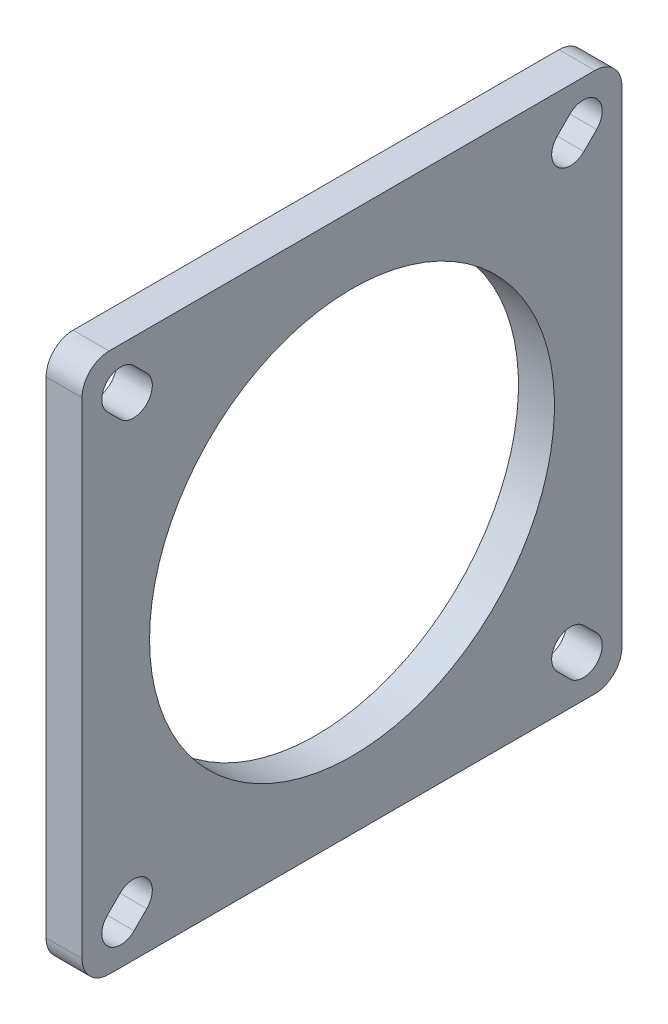
ISO-10303-21;
HEADER;
FILE_DESCRIPTION(('STEP AP214'),'2;1');
FILE_NAME('part.step','',(''),(''),'','','');
FILE_SCHEMA(('AUTOMOTIVE_DESIGN { 1 0 10303 214 1 1 1 1 }'));
ENDSEC;
DATA;
#1=APPLICATION_CONTEXT('core data for automotive mechanical design processes');
#2=APPLICATION_PROTOCOL_DEFINITION('international standard','automotive_design',2000,#1);
#3=PRODUCT_CONTEXT('',#1,'mechanical');
#4=PRODUCT('Part','Part','',(#3));
#5=PRODUCT_RELATED_PRODUCT_CATEGORY('part','',(#4));
#6=PRODUCT_DEFINITION_FORMATION('','',#4);
#7=PRODUCT_DEFINITION_CONTEXT('part definition',#1,'design');
#8=PRODUCT_DEFINITION('design','',#6,#7);
#9=PRODUCT_DEFINITION_SHAPE('','',#8);
#10=(LENGTH_UNIT() NAMED_UNIT(*) SI_UNIT(.MILLI.,.METRE.));
#11=(NAMED_UNIT(*) PLANE_ANGLE_UNIT() SI_UNIT($,.RADIAN.));
#12=(NAMED_UNIT(*) SI_UNIT($,.STERADIAN.) SOLID_ANGLE_UNIT());
#13=UNCERTAINTY_MEASURE_WITH_UNIT(LENGTH_MEASURE(1.E-05),#10,'distance_accuracy_value','');
#14=(GEOMETRIC_REPRESENTATION_CONTEXT(3) GLOBAL_UNCERTAINTY_ASSIGNED_CONTEXT((#13)) GLOBAL_UNIT_ASSIGNED_CONTEXT((#10,
#11,#12)) REPRESENTATION_CONTEXT('',''));
#15=CARTESIAN_POINT('',(0.,0.,0.));
#16=DIRECTION('',(0.,0.,1.));
#17=DIRECTION('',(1.,0.,0.));
#18=AXIS2_PLACEMENT_3D('',#15,#16,#17);
#19=CARTESIAN_POINT('',(0.,22.5,0.));
#20=DIRECTION('',(1.,0.,0.));
#21=DIRECTION('',(0.,0.,-1.));
#22=AXIS2_PLACEMENT_3D('',#19,#20,#21);
#23=PLANE('',#22);
#24=DIRECTION('',(0.,-0.707106781186549,-0.707106781186546));
#25=VECTOR('',#24,1.);
#26=CARTESIAN_POINT('',(0.,-27.1920310216784,-24.222182540695));
#27=LINE('',#26,#25);
#28=CARTESIAN_POINT('',(0.,-27.1920310216784,-24.222182540695));
#29=VERTEX_POINT('',#28);
#30=CARTESIAN_POINT('',(0.,-25.7778174593053,-22.8079689783219));
#31=VERTEX_POINT('',#30);
#32=EDGE_CURVE('E369',#29,#31,#27,.F.);
#33=ORIENTED_EDGE('',*,*,#32,.F.);
#34=CARTESIAN_POINT('',(0.,-25.7071067811866,-25.7071067811867));
#35=DIRECTION('',(-1.,0.,0.));
#36=DIRECTION('',(0.,0.,1.));
#37=AXIS2_PLACEMENT_3D('',#34,#35,#36);
#38=CIRCLE('',#37,2.1);
#39=CARTESIAN_POINT('',(0.,-24.2221825406949,-27.1920310216785));
#40=VERTEX_POINT('',#39);
#41=EDGE_CURVE('E216',#40,#29,#38,.T.);
#42=ORIENTED_EDGE('',*,*,#41,.F.);
#43=DIRECTION('',(0.,0.707106781186547,0.707106781186549));
#44=VECTOR('',#43,1.);
#45=CARTESIAN_POINT('',(0.,-24.2221825406949,-27.1920310216785));
#46=LINE('',#45,#44);
#47=CARTESIAN_POINT('',(0.,-22.8079689783218,-25.7778174593054));
#48=VERTEX_POINT('',#47);
#49=EDGE_CURVE('E373',#48,#40,#46,.F.);
#50=ORIENTED_EDGE('',*,*,#49,.F.);
#51=CARTESIAN_POINT('',(0.,-24.2928932188135,-24.2928932188136));
#52=DIRECTION('',(-1.,0.,0.));
#53=DIRECTION('',(0.,0.,1.));
#54=AXIS2_PLACEMENT_3D('',#51,#52,#53);
#55=CIRCLE('',#54,2.09999999999999);
#56=EDGE_CURVE('E371',#31,#48,#55,.T.);
#57=ORIENTED_EDGE('',*,*,#56,.F.);
#58=EDGE_LOOP('',(#33,#42,#50,#57));
#59=FACE_BOUND('',#58,.T.);
#60=DIRECTION('',(0.,-0.707106781186548,0.707106781186547));
#61=VECTOR('',#60,1.);
#62=CARTESIAN_POINT('',(0.,-24.2221825406951,27.1920310216783));
#63=LINE('',#62,#61);
#64=CARTESIAN_POINT('',(0.,-24.2221825406951,27.1920310216783));
#65=VERTEX_POINT('',#64);
#66=CARTESIAN_POINT('',(0.,-22.807968978322,25.7778174593052));
#67=VERTEX_POINT('',#66);
#68=EDGE_CURVE('E360',#65,#67,#63,.F.);
#69=ORIENTED_EDGE('',*,*,#68,.F.);
#70=CARTESIAN_POINT('',(0.,-25.7071067811868,25.7071067811865));
#71=DIRECTION('',(-1.,0.,0.));
#72=DIRECTION('',(0.,0.,1.));
#73=AXIS2_PLACEMENT_3D('',#70,#71,#72);
#74=CIRCLE('',#73,2.1);
#75=CARTESIAN_POINT('',(0.,-27.1920310216786,24.2221825406948));
#76=VERTEX_POINT('',#75);
#77=EDGE_CURVE('E366',#76,#65,#74,.T.);
#78=ORIENTED_EDGE('',*,*,#77,.F.);
#79=DIRECTION('',(0.,0.707106781186551,-0.707106781186544));
#80=VECTOR('',#79,1.);
#81=CARTESIAN_POINT('',(0.,-27.1920310216786,24.2221825406948));
#82=LINE('',#81,#80);
#83=CARTESIAN_POINT('',(0.,-25.7778174593055,22.8079689783217));
#84=VERTEX_POINT('',#83);
#85=EDGE_CURVE('E364',#84,#76,#82,.F.);
#86=ORIENTED_EDGE('',*,*,#85,.F.);
#87=CARTESIAN_POINT('',(0.,-24.2928932188137,24.2928932188135));
#88=DIRECTION('',(-1.,0.,0.));
#89=DIRECTION('',(0.,0.,1.));
#90=AXIS2_PLACEMENT_3D('',#87,#88,#89);
#91=CIRCLE('',#90,2.09999999999999);
#92=EDGE_CURVE('E362',#67,#84,#91,.T.);
#93=ORIENTED_EDGE('',*,*,#92,.F.);
#94=EDGE_LOOP('',(#69,#78,#86,#93));
#95=FACE_BOUND('',#94,.T.);
#96=DIRECTION('',(0.,0.707106781186554,0.707106781186541));
#97=VECTOR('',#96,1.);
#98=CARTESIAN_POINT('',(0.,27.1920310216786,24.2221825406948));
#99=LINE('',#98,#97);
#100=CARTESIAN_POINT('',(0.,27.1920310216786,24.2221825406948));
#101=VERTEX_POINT('',#100);
#102=CARTESIAN_POINT('',(0.,25.7778174593054,22.8079689783217));
#103=VERTEX_POINT('',#102);
#104=EDGE_CURVE('E246',#101,#103,#99,.F.);
#105=ORIENTED_EDGE('',*,*,#104,.F.);
#106=CARTESIAN_POINT('',(0.,25.7071067811868,25.7071067811866));
#107=DIRECTION('',(-1.,0.,0.));
#108=DIRECTION('',(0.,0.,1.));
#109=AXIS2_PLACEMENT_3D('',#106,#107,#108);
#110=CIRCLE('',#109,2.1);
#111=CARTESIAN_POINT('',(0.,24.2221825406951,27.1920310216783));
#112=VERTEX_POINT('',#111);
#113=EDGE_CURVE('E357',#112,#101,#110,.T.);
#114=ORIENTED_EDGE('',*,*,#113,.F.);
#115=DIRECTION('',(0.,-0.707106781186551,-0.707106781186544));
#116=VECTOR('',#115,1.);
#117=CARTESIAN_POINT('',(0.,24.2221825406951,27.1920310216783));
#118=LINE('',#117,#116);
#119=CARTESIAN_POINT('',(0.,22.807968978322,25.7778174593052));
#120=VERTEX_POINT('',#119);
#121=EDGE_CURVE('E355',#120,#112,#118,.F.);
#122=ORIENTED_EDGE('',*,*,#121,.F.);
#123=CARTESIAN_POINT('',(0.,24.2928932188137,24.2928932188135));
#124=DIRECTION('',(-1.,0.,0.));
#125=DIRECTION('',(0.,0.,1.));
#126=AXIS2_PLACEMENT_3D('',#123,#124,#125);
#127=CIRCLE('',#126,2.09999999999999);
#128=EDGE_CURVE('E353',#103,#120,#127,.T.);
#129=ORIENTED_EDGE('',*,*,#128,.F.);
#130=EDGE_LOOP('',(#105,#114,#122,#129));
#131=FACE_BOUND('',#130,.T.);
#132=DIRECTION('',(0.,0.707106781186548,-0.707106781186547));
#133=VECTOR('',#132,1.);
#134=CARTESIAN_POINT('',(0.,24.2221825406951,-27.1920310216783));
#135=LINE('',#134,#133);
#136=CARTESIAN_POINT('',(0.,24.2221825406951,-27.1920310216783));
#137=VERTEX_POINT('',#136);
#138=CARTESIAN_POINT('',(0.,22.807968978322,-25.7778174593052));
#139=VERTEX_POINT('',#138);
#140=EDGE_CURVE('E311',#137,#139,#135,.F.);
#141=ORIENTED_EDGE('',*,*,#140,.F.);
#142=CARTESIAN_POINT('',(0.,25.7071067811868,-25.7071067811865));
#143=DIRECTION('',(-1.,0.,0.));
#144=DIRECTION('',(0.,0.,1.));
#145=AXIS2_PLACEMENT_3D('',#142,#143,#144);
#146=CIRCLE('',#145,2.1);
#147=CARTESIAN_POINT('',(0.,27.1920310216786,-24.2221825406948));
#148=VERTEX_POINT('',#147);
#149=EDGE_CURVE('E319',#148,#137,#146,.T.);
#150=ORIENTED_EDGE('',*,*,#149,.F.);
#151=DIRECTION('',(0.,-0.707106781186551,0.707106781186544));
#152=VECTOR('',#151,1.);
#153=CARTESIAN_POINT('',(0.,27.1920310216786,-24.2221825406948));
#154=LINE('',#153,#152);
#155=CARTESIAN_POINT('',(0.,25.7778174593055,-22.8079689783217));
#156=VERTEX_POINT('',#155);
#157=EDGE_CURVE('E348',#156,#148,#154,.F.);
#158=ORIENTED_EDGE('',*,*,#157,.F.);
#159=CARTESIAN_POINT('',(0.,24.2928932188137,-24.2928932188135));
#160=DIRECTION('',(-1.,0.,0.));
#161=DIRECTION('',(0.,0.,1.));
#162=AXIS2_PLACEMENT_3D('',#159,#160,#161);
#163=CIRCLE('',#162,2.09999999999999);
#164=EDGE_CURVE('E346',#139,#156,#163,.T.);
#165=ORIENTED_EDGE('',*,*,#164,.F.);
#166=EDGE_LOOP('',(#141,#150,#158,#165));
#167=FACE_BOUND('',#166,.T.);
#168=CARTESIAN_POINT('',(0.,0.,0.));
#169=DIRECTION('',(-1.,0.,0.));
#170=DIRECTION('',(0.,0.,1.));
#171=AXIS2_PLACEMENT_3D('',#168,#169,#170);
#172=CIRCLE('',#171,22.5);
#173=CARTESIAN_POINT('',(0.,0.,22.5));
#174=VERTEX_POINT('',#173);
#175=EDGE_CURVE('E341',#174,#174,#172,.T.);
#176=ORIENTED_EDGE('',*,*,#175,.F.);
#177=EDGE_LOOP('',(#176));
#178=FACE_BOUND('',#177,.T.);
#179=DIRECTION('',(0.,1.,0.));
#180=VECTOR('',#179,1.);
#181=CARTESIAN_POINT('',(0.,22.5,-30.));
#182=LINE('',#181,#180);
#183=CARTESIAN_POINT('',(0.,-27.,-30.));
#184=VERTEX_POINT('',#183);
#185=CARTESIAN_POINT('',(0.,27.,-30.));
#186=VERTEX_POINT('',#185);
#187=EDGE_CURVE('E335',#184,#186,#182,.T.);
#188=ORIENTED_EDGE('',*,*,#187,.F.);
#189=CARTESIAN_POINT('',(0.,-27.,-27.));
#190=DIRECTION('',(1.,0.,0.));
#191=DIRECTION('',(0.,0.,-1.));
#192=AXIS2_PLACEMENT_3D('',#189,#190,#191);
#193=CIRCLE('',#192,3.);
#194=CARTESIAN_POINT('',(0.,-30.,-27.));
#195=VERTEX_POINT('',#194);
#196=EDGE_CURVE('E386',#184,#195,#193,.F.);
#197=ORIENTED_EDGE('',*,*,#196,.T.);
#198=DIRECTION('',(0.,0.,-1.));
#199=VECTOR('',#198,1.);
#200=CARTESIAN_POINT('',(0.,-30.,0.));
#201=LINE('',#200,#199);
#202=CARTESIAN_POINT('',(0.,-30.,27.));
#203=VERTEX_POINT('',#202);
#204=EDGE_CURVE('E327',#203,#195,#201,.T.);
#205=ORIENTED_EDGE('',*,*,#204,.F.);
#206=CARTESIAN_POINT('',(0.,-27.,27.));
#207=DIRECTION('',(1.,0.,0.));
#208=DIRECTION('',(0.,0.,-1.));
#209=AXIS2_PLACEMENT_3D('',#206,#207,#208);
#210=CIRCLE('',#209,3.);
#211=CARTESIAN_POINT('',(0.,-27.,30.));
#212=VERTEX_POINT('',#211);
#213=EDGE_CURVE('E384',#203,#212,#210,.F.);
#214=ORIENTED_EDGE('',*,*,#213,.T.);
#215=DIRECTION('',(0.,-1.,0.));
#216=VECTOR('',#215,1.);
#217=CARTESIAN_POINT('',(0.,22.5,30.));
#218=LINE('',#217,#216);
#219=CARTESIAN_POINT('',(0.,27.,30.));
#220=VERTEX_POINT('',#219);
#221=EDGE_CURVE('E330',#220,#212,#218,.T.);
#222=ORIENTED_EDGE('',*,*,#221,.F.);
#223=CARTESIAN_POINT('',(0.,27.,27.));
#224=DIRECTION('',(1.,0.,0.));
#225=DIRECTION('',(0.,0.,-1.));
#226=AXIS2_PLACEMENT_3D('',#223,#224,#225);
#227=CIRCLE('',#226,3.);
#228=CARTESIAN_POINT('',(0.,30.,27.));
#229=VERTEX_POINT('',#228);
#230=EDGE_CURVE('E382',#220,#229,#227,.F.);
#231=ORIENTED_EDGE('',*,*,#230,.T.);
#232=DIRECTION('',(0.,0.,1.));
#233=VECTOR('',#232,1.);
#234=CARTESIAN_POINT('',(0.,30.,0.));
#235=LINE('',#234,#233);
#236=CARTESIAN_POINT('',(0.,30.,-27.));
#237=VERTEX_POINT('',#236);
#238=EDGE_CURVE('E332',#237,#229,#235,.T.);
#239=ORIENTED_EDGE('',*,*,#238,.F.);
#240=CARTESIAN_POINT('',(0.,27.,-27.));
#241=DIRECTION('',(1.,0.,0.));
#242=DIRECTION('',(0.,0.,-1.));
#243=AXIS2_PLACEMENT_3D('',#240,#241,#242);
#244=CIRCLE('',#243,3.);
#245=EDGE_CURVE('E380',#237,#186,#244,.F.);
#246=ORIENTED_EDGE('',*,*,#245,.T.);
#247=EDGE_LOOP('',(#188,#197,#205,#214,#222,#231,#239,#246));
#248=FACE_BOUND('',#247,.T.);
#249=ADVANCED_FACE('F46',(#59,#95,#131,#167,#178,#248),#23,.F.);
#250=CARTESIAN_POINT('',(4.,50.,0.));
#251=DIRECTION('',(-1.,0.,0.));
#252=DIRECTION('',(0.,0.,1.));
#253=AXIS2_PLACEMENT_3D('',#250,#251,#252);
#254=PLANE('',#253);
#255=DIRECTION('',(0.,-0.707106781186546,-0.707106781186549));
#256=VECTOR('',#255,1.);
#257=CARTESIAN_POINT('',(4.00000000000001,-24.2221825406949,-27.1920310216785));
#258=LINE('',#257,#256);
#259=CARTESIAN_POINT('',(4.00000000000001,-22.8079689783218,-25.7778174593054));
#260=VERTEX_POINT('',#259);
#261=CARTESIAN_POINT('',(4.00000000000001,-24.2221825406949,-27.1920310216785));
#262=VERTEX_POINT('',#261);
#263=EDGE_CURVE('E220',#260,#262,#258,.T.);
#264=ORIENTED_EDGE('',*,*,#263,.T.);
#265=CARTESIAN_POINT('',(4.00000000000001,-25.7071067811866,-25.7071067811867));
#266=DIRECTION('',(-1.,0.,0.));
#267=DIRECTION('',(0.,1.,0.));
#268=AXIS2_PLACEMENT_3D('',#265,#266,#267);
#269=CIRCLE('',#268,2.1);
#270=CARTESIAN_POINT('',(4.00000000000001,-27.1920310216784,-24.222182540695));
#271=VERTEX_POINT('',#270);
#272=EDGE_CURVE('E213',#262,#271,#269,.T.);
#273=ORIENTED_EDGE('',*,*,#272,.T.);
#274=DIRECTION('',(0.,0.707106781186549,0.707106781186546));
#275=VECTOR('',#274,1.);
#276=CARTESIAN_POINT('',(4.00000000000001,-27.1920310216784,-24.222182540695));
#277=LINE('',#276,#275);
#278=CARTESIAN_POINT('',(4.,-25.7778174593053,-22.8079689783219));
#279=VERTEX_POINT('',#278);
#280=EDGE_CURVE('E224',#271,#279,#277,.T.);
#281=ORIENTED_EDGE('',*,*,#280,.T.);
#282=CARTESIAN_POINT('',(4.00000000000001,-24.2928932188135,-24.2928932188136));
#283=DIRECTION('',(-1.,0.,0.));
#284=DIRECTION('',(0.,1.,0.));
#285=AXIS2_PLACEMENT_3D('',#282,#283,#284);
#286=CIRCLE('',#285,2.09999999999999);
#287=EDGE_CURVE('E229',#279,#260,#286,.T.);
#288=ORIENTED_EDGE('',*,*,#287,.T.);
#289=EDGE_LOOP('',(#264,#273,#281,#288));
#290=FACE_BOUND('',#289,.T.);
#291=DIRECTION('',(0.,-0.707106781186551,0.707106781186544));
#292=VECTOR('',#291,1.);
#293=CARTESIAN_POINT('',(4.00000000000001,-27.1920310216786,24.2221825406948));
#294=LINE('',#293,#292);
#295=CARTESIAN_POINT('',(4.00000000000001,-25.7778174593055,22.8079689783217));
#296=VERTEX_POINT('',#295);
#297=CARTESIAN_POINT('',(4.00000000000001,-27.1920310216786,24.2221825406948));
#298=VERTEX_POINT('',#297);
#299=EDGE_CURVE('E259',#296,#298,#294,.T.);
#300=ORIENTED_EDGE('',*,*,#299,.T.);
#301=CARTESIAN_POINT('',(4.00000000000001,-25.7071067811868,25.7071067811865));
#302=DIRECTION('',(-1.,0.,0.));
#303=DIRECTION('',(0.,0.,-1.));
#304=AXIS2_PLACEMENT_3D('',#301,#302,#303);
#305=CIRCLE('',#304,2.1);
#306=CARTESIAN_POINT('',(4.00000000000001,-24.2221825406951,27.1920310216783));
#307=VERTEX_POINT('',#306);
#308=EDGE_CURVE('E249',#298,#307,#305,.T.);
#309=ORIENTED_EDGE('',*,*,#308,.T.);
#310=DIRECTION('',(0.,0.707106781186548,-0.707106781186547));
#311=VECTOR('',#310,1.);
#312=CARTESIAN_POINT('',(4.00000000000001,-24.2221825406951,27.1920310216783));
#313=LINE('',#312,#311);
#314=CARTESIAN_POINT('',(4.,-22.807968978322,25.7778174593052));
#315=VERTEX_POINT('',#314);
#316=EDGE_CURVE('E252',#307,#315,#313,.T.);
#317=ORIENTED_EDGE('',*,*,#316,.T.);
#318=CARTESIAN_POINT('',(4.00000000000001,-24.2928932188137,24.2928932188135));
#319=DIRECTION('',(-1.,0.,0.));
#320=DIRECTION('',(0.,0.,-1.));
#321=AXIS2_PLACEMENT_3D('',#318,#319,#320);
#322=CIRCLE('',#321,2.09999999999999);
#323=EDGE_CURVE('E256',#315,#296,#322,.T.);
#324=ORIENTED_EDGE('',*,*,#323,.T.);
#325=EDGE_LOOP('',(#300,#309,#317,#324));
#326=FACE_BOUND('',#325,.T.);
#327=DIRECTION('',(0.,0.707106781186551,0.707106781186544));
#328=VECTOR('',#327,1.);
#329=CARTESIAN_POINT('',(4.00000000000001,24.2221825406951,27.1920310216783));
#330=LINE('',#329,#328);
#331=CARTESIAN_POINT('',(4.00000000000001,22.807968978322,25.7778174593052));
#332=VERTEX_POINT('',#331);
#333=CARTESIAN_POINT('',(4.00000000000001,24.2221825406951,27.1920310216783));
#334=VERTEX_POINT('',#333);
#335=EDGE_CURVE('E278',#332,#334,#330,.T.);
#336=ORIENTED_EDGE('',*,*,#335,.T.);
#337=CARTESIAN_POINT('',(4.00000000000001,25.7071067811868,25.7071067811866));
#338=DIRECTION('',(-1.,0.,0.));
#339=DIRECTION('',(0.,-1.,0.));
#340=AXIS2_PLACEMENT_3D('',#337,#338,#339);
#341=CIRCLE('',#340,2.1);
#342=CARTESIAN_POINT('',(4.00000000000001,27.1920310216786,24.2221825406948));
#343=VERTEX_POINT('',#342);
#344=EDGE_CURVE('E269',#334,#343,#341,.T.);
#345=ORIENTED_EDGE('',*,*,#344,.T.);
#346=DIRECTION('',(0.,-0.707106781186554,-0.707106781186541));
#347=VECTOR('',#346,1.);
#348=CARTESIAN_POINT('',(4.00000000000001,27.1920310216786,24.2221825406948));
#349=LINE('',#348,#347);
#350=CARTESIAN_POINT('',(4.,25.7778174593054,22.8079689783217));
#351=VERTEX_POINT('',#350);
#352=EDGE_CURVE('E272',#343,#351,#349,.T.);
#353=ORIENTED_EDGE('',*,*,#352,.T.);
#354=CARTESIAN_POINT('',(4.00000000000001,24.2928932188137,24.2928932188135));
#355=DIRECTION('',(-1.,0.,0.));
#356=DIRECTION('',(0.,-1.,0.));
#357=AXIS2_PLACEMENT_3D('',#354,#355,#356);
#358=CIRCLE('',#357,2.09999999999999);
#359=EDGE_CURVE('E275',#351,#332,#358,.T.);
#360=ORIENTED_EDGE('',*,*,#359,.T.);
#361=EDGE_LOOP('',(#336,#345,#353,#360));
#362=FACE_BOUND('',#361,.T.);
#363=DIRECTION('',(0.,0.707106781186551,-0.707106781186544));
#364=VECTOR('',#363,1.);
#365=CARTESIAN_POINT('',(4.00000000000001,27.1920310216786,-24.2221825406948));
#366=LINE('',#365,#364);
#367=CARTESIAN_POINT('',(4.00000000000001,25.7778174593055,-22.8079689783217));
#368=VERTEX_POINT('',#367);
#369=CARTESIAN_POINT('',(4.00000000000001,27.1920310216786,-24.2221825406948));
#370=VERTEX_POINT('',#369);
#371=EDGE_CURVE('E300',#368,#370,#366,.T.);
#372=ORIENTED_EDGE('',*,*,#371,.T.);
#373=CARTESIAN_POINT('',(4.00000000000001,25.7071067811868,-25.7071067811865));
#374=DIRECTION('',(-1.,0.,0.));
#375=DIRECTION('',(0.,0.,1.));
#376=AXIS2_PLACEMENT_3D('',#373,#374,#375);
#377=CIRCLE('',#376,2.1);
#378=CARTESIAN_POINT('',(4.00000000000001,24.2221825406951,-27.1920310216783));
#379=VERTEX_POINT('',#378);
#380=EDGE_CURVE('E291',#370,#379,#377,.T.);
#381=ORIENTED_EDGE('',*,*,#380,.T.);
#382=DIRECTION('',(0.,-0.707106781186548,0.707106781186547));
#383=VECTOR('',#382,1.);
#384=CARTESIAN_POINT('',(4.00000000000001,24.2221825406951,-27.1920310216783));
#385=LINE('',#384,#383);
#386=CARTESIAN_POINT('',(4.,22.807968978322,-25.7778174593052));
#387=VERTEX_POINT('',#386);
#388=EDGE_CURVE('E294',#379,#387,#385,.T.);
#389=ORIENTED_EDGE('',*,*,#388,.T.);
#390=CARTESIAN_POINT('',(4.00000000000001,24.2928932188137,-24.2928932188135));
#391=DIRECTION('',(-1.,0.,0.));
#392=DIRECTION('',(0.,0.,1.));
#393=AXIS2_PLACEMENT_3D('',#390,#391,#392);
#394=CIRCLE('',#393,2.09999999999999);
#395=EDGE_CURVE('E297',#387,#368,#394,.T.);
#396=ORIENTED_EDGE('',*,*,#395,.T.);
#397=EDGE_LOOP('',(#372,#381,#389,#396));
#398=FACE_BOUND('',#397,.T.);
#399=CARTESIAN_POINT('',(4.00000000000001,0.,0.));
#400=DIRECTION('',(-1.,0.,0.));
#401=DIRECTION('',(0.,0.,1.));
#402=AXIS2_PLACEMENT_3D('',#399,#400,#401);
#403=CIRCLE('',#402,22.5);
#404=CARTESIAN_POINT('',(4.00000000000001,0.,22.5));
#405=VERTEX_POINT('',#404);
#406=EDGE_CURVE('E338',#405,#405,#403,.T.);
#407=ORIENTED_EDGE('',*,*,#406,.T.);
#408=EDGE_LOOP('',(#407));
#409=FACE_BOUND('',#408,.T.);
#410=DIRECTION('',(0.,0.,1.));
#411=VECTOR('',#410,1.);
#412=CARTESIAN_POINT('',(4.00000000000001,-30.,30.));
#413=LINE('',#412,#411);
#414=CARTESIAN_POINT('',(4.00000000000001,-30.,-27.));
#415=VERTEX_POINT('',#414);
#416=CARTESIAN_POINT('',(4.00000000000001,-30.,27.));
#417=VERTEX_POINT('',#416);
#418=EDGE_CURVE('E318',#415,#417,#413,.T.);
#419=ORIENTED_EDGE('',*,*,#418,.F.);
#420=CARTESIAN_POINT('',(4.,-27.,-27.));
#421=DIRECTION('',(-1.,0.,0.));
#422=DIRECTION('',(0.,0.,1.));
#423=AXIS2_PLACEMENT_3D('',#420,#421,#422);
#424=CIRCLE('',#423,3.);
#425=CARTESIAN_POINT('',(4.00000000000001,-27.,-30.));
#426=VERTEX_POINT('',#425);
#427=EDGE_CURVE('E398',#415,#426,#424,.F.);
#428=ORIENTED_EDGE('',*,*,#427,.T.);
#429=DIRECTION('',(0.,-1.,0.));
#430=VECTOR('',#429,1.);
#431=CARTESIAN_POINT('',(4.00000000000001,-30.,-30.));
#432=LINE('',#431,#430);
#433=CARTESIAN_POINT('',(4.00000000000001,27.,-30.));
#434=VERTEX_POINT('',#433);
#435=EDGE_CURVE('E315',#434,#426,#432,.T.);
#436=ORIENTED_EDGE('',*,*,#435,.F.);
#437=CARTESIAN_POINT('',(4.,27.,-27.));
#438=DIRECTION('',(-1.,0.,0.));
#439=DIRECTION('',(0.,0.,1.));
#440=AXIS2_PLACEMENT_3D('',#437,#438,#439);
#441=CIRCLE('',#440,3.);
#442=CARTESIAN_POINT('',(4.00000000000001,30.,-27.));
#443=VERTEX_POINT('',#442);
#444=EDGE_CURVE('E393',#434,#443,#441,.F.);
#445=ORIENTED_EDGE('',*,*,#444,.T.);
#446=DIRECTION('',(0.,0.,-1.));
#447=VECTOR('',#446,1.);
#448=CARTESIAN_POINT('',(4.00000000000001,30.,30.));
#449=LINE('',#448,#447);
#450=CARTESIAN_POINT('',(4.00000000000001,30.,27.));
#451=VERTEX_POINT('',#450);
#452=EDGE_CURVE('E324',#451,#443,#449,.T.);
#453=ORIENTED_EDGE('',*,*,#452,.F.);
#454=CARTESIAN_POINT('',(4.,27.,27.));
#455=DIRECTION('',(-1.,0.,0.));
#456=DIRECTION('',(0.,0.,1.));
#457=AXIS2_PLACEMENT_3D('',#454,#455,#456);
#458=CIRCLE('',#457,3.);
#459=CARTESIAN_POINT('',(4.00000000000001,27.,30.));
#460=VERTEX_POINT('',#459);
#461=EDGE_CURVE('E61',#451,#460,#458,.F.);
#462=ORIENTED_EDGE('',*,*,#461,.T.);
#463=DIRECTION('',(0.,1.,0.));
#464=VECTOR('',#463,1.);
#465=CARTESIAN_POINT('',(4.00000000000001,-30.,30.));
#466=LINE('',#465,#464);
#467=CARTESIAN_POINT('',(4.00000000000001,-27.,30.));
#468=VERTEX_POINT('',#467);
#469=EDGE_CURVE('E322',#468,#460,#466,.T.);
#470=ORIENTED_EDGE('',*,*,#469,.F.);
#471=CARTESIAN_POINT('',(4.,-27.,27.));
#472=DIRECTION('',(-1.,0.,0.));
#473=DIRECTION('',(0.,0.,1.));
#474=AXIS2_PLACEMENT_3D('',#471,#472,#473);
#475=CIRCLE('',#474,3.);
#476=EDGE_CURVE('E396',#468,#417,#475,.F.);
#477=ORIENTED_EDGE('',*,*,#476,.T.);
#478=EDGE_LOOP('',(#419,#428,#436,#445,#453,#462,#470,#477));
#479=FACE_BOUND('',#478,.T.);
#480=ADVANCED_FACE('F231',(#290,#326,#362,#398,#409,#479),#254,.F.);
#481=CARTESIAN_POINT('',(-29.3651203100726,0.,0.));
#482=DIRECTION('',(-1.,0.,0.));
#483=DIRECTION('',(0.,0.,1.));
#484=AXIS2_PLACEMENT_3D('',#481,#482,#483);
#485=CYLINDRICAL_SURFACE('',#484,22.5);
#486=ORIENTED_EDGE('',*,*,#406,.F.);
#487=EDGE_LOOP('',(#486));
#488=FACE_BOUND('',#487,.T.);
#489=ORIENTED_EDGE('',*,*,#175,.T.);
#490=EDGE_LOOP('',(#489));
#491=FACE_BOUND('',#490,.T.);
#492=ADVANCED_FACE('F446',(#488,#491),#485,.F.);
#493=CARTESIAN_POINT('',(4.00000000000001,-30.,-30.));
#494=DIRECTION('',(0.,0.,-1.));
#495=DIRECTION('',(-1.,0.,0.));
#496=AXIS2_PLACEMENT_3D('',#493,#494,#495);
#497=PLANE('',#496);
#498=ORIENTED_EDGE('',*,*,#435,.T.);
#499=DIRECTION('',(-1.,0.,0.));
#500=VECTOR('',#499,1.);
#501=CARTESIAN_POINT('',(4.00000000000001,-27.,-30.));
#502=LINE('',#501,#500);
#503=EDGE_CURVE('E377',#426,#184,#502,.T.);
#504=ORIENTED_EDGE('',*,*,#503,.T.);
#505=ORIENTED_EDGE('',*,*,#187,.T.);
#506=DIRECTION('',(-1.,0.,0.));
#507=VECTOR('',#506,1.);
#508=CARTESIAN_POINT('',(4.00000000000001,27.,-30.));
#509=LINE('',#508,#507);
#510=EDGE_CURVE('E344',#186,#434,#509,.F.);
#511=ORIENTED_EDGE('',*,*,#510,.T.);
#512=EDGE_LOOP('',(#498,#504,#505,#511));
#513=FACE_BOUND('',#512,.T.);
#514=ADVANCED_FACE('F432',(#513),#497,.T.);
#515=CARTESIAN_POINT('',(4.00000000000001,30.,30.));
#516=DIRECTION('',(0.,1.,0.));
#517=DIRECTION('',(0.,0.,1.));
#518=AXIS2_PLACEMENT_3D('',#515,#516,#517);
#519=PLANE('',#518);
#520=ORIENTED_EDGE('',*,*,#238,.T.);
#521=DIRECTION('',(-1.,0.,0.));
#522=VECTOR('',#521,1.);
#523=CARTESIAN_POINT('',(4.00000000000001,30.,27.));
#524=LINE('',#523,#522);
#525=EDGE_CURVE('E11',#229,#451,#524,.F.);
#526=ORIENTED_EDGE('',*,*,#525,.T.);
#527=ORIENTED_EDGE('',*,*,#452,.T.);
#528=DIRECTION('',(-1.,0.,0.));
#529=VECTOR('',#528,1.);
#530=CARTESIAN_POINT('',(4.00000000000001,30.,-27.));
#531=LINE('',#530,#529);
#532=EDGE_CURVE('E54',#443,#237,#531,.T.);
#533=ORIENTED_EDGE('',*,*,#532,.T.);
#534=EDGE_LOOP('',(#520,#526,#527,#533));
#535=FACE_BOUND('',#534,.T.);
#536=ADVANCED_FACE('F407',(#535),#519,.T.);
#537=CARTESIAN_POINT('',(4.00000000000001,-30.,30.));
#538=DIRECTION('',(0.,0.,1.));
#539=DIRECTION('',(0.,-1.,0.));
#540=AXIS2_PLACEMENT_3D('',#537,#538,#539);
#541=PLANE('',#540);
#542=ORIENTED_EDGE('',*,*,#221,.T.);
#543=DIRECTION('',(-1.,0.,0.));
#544=VECTOR('',#543,1.);
#545=CARTESIAN_POINT('',(4.00000000000001,-27.,30.));
#546=LINE('',#545,#544);
#547=EDGE_CURVE('E68',#212,#468,#546,.F.);
#548=ORIENTED_EDGE('',*,*,#547,.T.);
#549=ORIENTED_EDGE('',*,*,#469,.T.);
#550=DIRECTION('',(-1.,0.,0.));
#551=VECTOR('',#550,1.);
#552=CARTESIAN_POINT('',(4.00000000000001,27.,30.));
#553=LINE('',#552,#551);
#554=EDGE_CURVE('E400',#460,#220,#553,.T.);
#555=ORIENTED_EDGE('',*,*,#554,.T.);
#556=EDGE_LOOP('',(#542,#548,#549,#555));
#557=FACE_BOUND('',#556,.T.);
#558=ADVANCED_FACE('F417',(#557),#541,.T.);
#559=CARTESIAN_POINT('',(4.00000000000001,-30.,30.));
#560=DIRECTION('',(0.,-1.,0.));
#561=DIRECTION('',(0.,0.,-1.));
#562=AXIS2_PLACEMENT_3D('',#559,#560,#561);
#563=PLANE('',#562);
#564=ORIENTED_EDGE('',*,*,#204,.T.);
#565=DIRECTION('',(-1.,0.,0.));
#566=VECTOR('',#565,1.);
#567=CARTESIAN_POINT('',(4.00000000000001,-30.,-27.));
#568=LINE('',#567,#566);
#569=EDGE_CURVE('E391',#195,#415,#568,.F.);
#570=ORIENTED_EDGE('',*,*,#569,.T.);
#571=ORIENTED_EDGE('',*,*,#418,.T.);
#572=DIRECTION('',(-1.,0.,0.));
#573=VECTOR('',#572,1.);
#574=CARTESIAN_POINT('',(4.00000000000001,-30.,27.));
#575=LINE('',#574,#573);
#576=EDGE_CURVE('E388',#417,#203,#575,.T.);
#577=ORIENTED_EDGE('',*,*,#576,.T.);
#578=EDGE_LOOP('',(#564,#570,#571,#577));
#579=FACE_BOUND('',#578,.T.);
#580=ADVANCED_FACE('F425',(#579),#563,.T.);
#581=CARTESIAN_POINT('',(4.00000000000001,25.7071067811868,-25.7071067811865));
#582=DIRECTION('',(-1.,0.,0.));
#583=DIRECTION('',(0.,0.,1.));
#584=AXIS2_PLACEMENT_3D('',#581,#582,#583);
#585=CYLINDRICAL_SURFACE('',#584,2.1);
#586=DIRECTION('',(-1.,0.,0.));
#587=VECTOR('',#586,1.);
#588=CARTESIAN_POINT('',(4.00000000000001,24.2221825406951,-27.1920310216783));
#589=LINE('',#588,#587);
#590=EDGE_CURVE('E303',#379,#137,#589,.T.);
#591=ORIENTED_EDGE('',*,*,#590,.F.);
#592=ORIENTED_EDGE('',*,*,#380,.F.);
#593=DIRECTION('',(-1.,0.,0.));
#594=VECTOR('',#593,1.);
#595=CARTESIAN_POINT('',(4.00000000000001,27.1920310216786,-24.2221825406948));
#596=LINE('',#595,#594);
#597=EDGE_CURVE('E307',#370,#148,#596,.T.);
#598=ORIENTED_EDGE('',*,*,#597,.T.);
#599=ORIENTED_EDGE('',*,*,#149,.T.);
#600=EDGE_LOOP('',(#591,#592,#598,#599));
#601=FACE_BOUND('',#600,.T.);
#602=ADVANCED_FACE('F607',(#601),#585,.F.);
#603=CARTESIAN_POINT('',(4.00000000000001,27.1920310216786,-24.2221825406948));
#604=DIRECTION('',(0.,0.707106781186544,0.707106781186551));
#605=DIRECTION('',(0.,-0.707106781186551,0.707106781186544));
#606=AXIS2_PLACEMENT_3D('',#603,#604,#605);
#607=PLANE('',#606);
#608=ORIENTED_EDGE('',*,*,#597,.F.);
#609=ORIENTED_EDGE('',*,*,#371,.F.);
#610=DIRECTION('',(-1.,0.,0.));
#611=VECTOR('',#610,1.);
#612=CARTESIAN_POINT('',(4.00000000000001,25.7778174593055,-22.8079689783217));
#613=LINE('',#612,#611);
#614=EDGE_CURVE('E304',#368,#156,#613,.T.);
#615=ORIENTED_EDGE('',*,*,#614,.T.);
#616=ORIENTED_EDGE('',*,*,#157,.T.);
#617=EDGE_LOOP('',(#608,#609,#615,#616));
#618=FACE_BOUND('',#617,.T.);
#619=ADVANCED_FACE('F598',(#618),#607,.F.);
#620=CARTESIAN_POINT('',(4.00000000000001,24.2928932188137,-24.2928932188135));
#621=DIRECTION('',(-1.,0.,0.));
#622=DIRECTION('',(0.,0.,1.));
#623=AXIS2_PLACEMENT_3D('',#620,#621,#622);
#624=CYLINDRICAL_SURFACE('',#623,2.09999999999999);
#625=ORIENTED_EDGE('',*,*,#614,.F.);
#626=ORIENTED_EDGE('',*,*,#395,.F.);
#627=DIRECTION('',(-1.,0.,0.));
#628=VECTOR('',#627,1.);
#629=CARTESIAN_POINT('',(4.00000000000001,22.807968978322,-25.7778174593052));
#630=LINE('',#629,#628);
#631=EDGE_CURVE('E308',#387,#139,#630,.T.);
#632=ORIENTED_EDGE('',*,*,#631,.T.);
#633=ORIENTED_EDGE('',*,*,#164,.T.);
#634=EDGE_LOOP('',(#625,#626,#632,#633));
#635=FACE_BOUND('',#634,.T.);
#636=ADVANCED_FACE('F589',(#635),#624,.F.);
#637=CARTESIAN_POINT('',(4.00000000000001,24.2221825406951,-27.1920310216783));
#638=DIRECTION('',(0.,-0.707106781186547,-0.707106781186548));
#639=DIRECTION('',(0.,0.707106781186548,-0.707106781186547));
#640=AXIS2_PLACEMENT_3D('',#637,#638,#639);
#641=PLANE('',#640);
#642=ORIENTED_EDGE('',*,*,#631,.F.);
#643=ORIENTED_EDGE('',*,*,#388,.F.);
#644=ORIENTED_EDGE('',*,*,#590,.T.);
#645=ORIENTED_EDGE('',*,*,#140,.T.);
#646=EDGE_LOOP('',(#642,#643,#644,#645));
#647=FACE_BOUND('',#646,.T.);
#648=ADVANCED_FACE('F580',(#647),#641,.F.);
#649=CARTESIAN_POINT('',(4.00000000000001,25.7071067811868,25.7071067811866));
#650=DIRECTION('',(-1.,0.,0.));
#651=DIRECTION('',(0.,0.,1.));
#652=AXIS2_PLACEMENT_3D('',#649,#650,#651);
#653=CYLINDRICAL_SURFACE('',#652,2.1);
#654=DIRECTION('',(-1.,0.,0.));
#655=VECTOR('',#654,1.);
#656=CARTESIAN_POINT('',(4.00000000000001,27.1920310216786,24.2221825406948));
#657=LINE('',#656,#655);
#658=EDGE_CURVE('E281',#343,#101,#657,.T.);
#659=ORIENTED_EDGE('',*,*,#658,.F.);
#660=ORIENTED_EDGE('',*,*,#344,.F.);
#661=DIRECTION('',(-1.,0.,0.));
#662=VECTOR('',#661,1.);
#663=CARTESIAN_POINT('',(4.00000000000001,24.2221825406951,27.1920310216783));
#664=LINE('',#663,#662);
#665=EDGE_CURVE('E253',#334,#112,#664,.T.);
#666=ORIENTED_EDGE('',*,*,#665,.T.);
#667=ORIENTED_EDGE('',*,*,#113,.T.);
#668=EDGE_LOOP('',(#659,#660,#666,#667));
#669=FACE_BOUND('',#668,.T.);
#670=ADVANCED_FACE('F571',(#669),#653,.F.);
#671=CARTESIAN_POINT('',(4.00000000000001,24.2221825406951,27.1920310216783));
#672=DIRECTION('',(0.,-0.707106781186544,0.707106781186551));
#673=DIRECTION('',(0.,-0.707106781186551,-0.707106781186544));
#674=AXIS2_PLACEMENT_3D('',#671,#672,#673);
#675=PLANE('',#674);
#676=ORIENTED_EDGE('',*,*,#665,.F.);
#677=ORIENTED_EDGE('',*,*,#335,.F.);
#678=DIRECTION('',(-1.,0.,0.));
#679=VECTOR('',#678,1.);
#680=CARTESIAN_POINT('',(4.00000000000001,22.807968978322,25.7778174593052));
#681=LINE('',#680,#679);
#682=EDGE_CURVE('E282',#332,#120,#681,.T.);
#683=ORIENTED_EDGE('',*,*,#682,.T.);
#684=ORIENTED_EDGE('',*,*,#121,.T.);
#685=EDGE_LOOP('',(#676,#677,#683,#684));
#686=FACE_BOUND('',#685,.T.);
#687=ADVANCED_FACE('F562',(#686),#675,.F.);
#688=CARTESIAN_POINT('',(4.00000000000001,24.2928932188137,24.2928932188135));
#689=DIRECTION('',(-1.,0.,0.));
#690=DIRECTION('',(0.,0.,1.));
#691=AXIS2_PLACEMENT_3D('',#688,#689,#690);
#692=CYLINDRICAL_SURFACE('',#691,2.09999999999999);
#693=ORIENTED_EDGE('',*,*,#682,.F.);
#694=ORIENTED_EDGE('',*,*,#359,.F.);
#695=DIRECTION('',(-1.,0.,0.));
#696=VECTOR('',#695,1.);
#697=CARTESIAN_POINT('',(4.00000000000001,25.7778174593054,22.8079689783217));
#698=LINE('',#697,#696);
#699=EDGE_CURVE('E285',#351,#103,#698,.T.);
#700=ORIENTED_EDGE('',*,*,#699,.T.);
#701=ORIENTED_EDGE('',*,*,#128,.T.);
#702=EDGE_LOOP('',(#693,#694,#700,#701));
#703=FACE_BOUND('',#702,.T.);
#704=ADVANCED_FACE('F553',(#703),#692,.F.);
#705=CARTESIAN_POINT('',(4.00000000000001,27.1920310216786,24.2221825406948));
#706=DIRECTION('',(0.,0.707106781186541,-0.707106781186554));
#707=DIRECTION('',(0.,0.707106781186554,0.707106781186541));
#708=AXIS2_PLACEMENT_3D('',#705,#706,#707);
#709=PLANE('',#708);
#710=ORIENTED_EDGE('',*,*,#699,.F.);
#711=ORIENTED_EDGE('',*,*,#352,.F.);
#712=ORIENTED_EDGE('',*,*,#658,.T.);
#713=ORIENTED_EDGE('',*,*,#104,.T.);
#714=EDGE_LOOP('',(#710,#711,#712,#713));
#715=FACE_BOUND('',#714,.T.);
#716=ADVANCED_FACE('F544',(#715),#709,.F.);
#717=CARTESIAN_POINT('',(4.00000000000001,-25.7071067811868,25.7071067811865));
#718=DIRECTION('',(-1.,0.,0.));
#719=DIRECTION('',(0.,0.,1.));
#720=AXIS2_PLACEMENT_3D('',#717,#718,#719);
#721=CYLINDRICAL_SURFACE('',#720,2.1);
#722=DIRECTION('',(-1.,0.,0.));
#723=VECTOR('',#722,1.);
#724=CARTESIAN_POINT('',(4.00000000000001,-24.2221825406951,27.1920310216783));
#725=LINE('',#724,#723);
#726=EDGE_CURVE('E262',#307,#65,#725,.T.);
#727=ORIENTED_EDGE('',*,*,#726,.F.);
#728=ORIENTED_EDGE('',*,*,#308,.F.);
#729=DIRECTION('',(-1.,0.,0.));
#730=VECTOR('',#729,1.);
#731=CARTESIAN_POINT('',(4.00000000000001,-27.1920310216786,24.2221825406948));
#732=LINE('',#731,#730);
#733=EDGE_CURVE('E234',#298,#76,#732,.T.);
#734=ORIENTED_EDGE('',*,*,#733,.T.);
#735=ORIENTED_EDGE('',*,*,#77,.T.);
#736=EDGE_LOOP('',(#727,#728,#734,#735));
#737=FACE_BOUND('',#736,.T.);
#738=ADVANCED_FACE('F535',(#737),#721,.F.);
#739=CARTESIAN_POINT('',(4.00000000000001,-27.1920310216786,24.2221825406948));
#740=DIRECTION('',(0.,-0.707106781186544,-0.707106781186551));
#741=DIRECTION('',(0.,0.707106781186551,-0.707106781186544));
#742=AXIS2_PLACEMENT_3D('',#739,#740,#741);
#743=PLANE('',#742);
#744=ORIENTED_EDGE('',*,*,#733,.F.);
#745=ORIENTED_EDGE('',*,*,#299,.F.);
#746=DIRECTION('',(-1.,0.,0.));
#747=VECTOR('',#746,1.);
#748=CARTESIAN_POINT('',(4.00000000000001,-25.7778174593055,22.8079689783217));
#749=LINE('',#748,#747);
#750=EDGE_CURVE('E237',#296,#84,#749,.T.);
#751=ORIENTED_EDGE('',*,*,#750,.T.);
#752=ORIENTED_EDGE('',*,*,#85,.T.);
#753=EDGE_LOOP('',(#744,#745,#751,#752));
#754=FACE_BOUND('',#753,.T.);
#755=ADVANCED_FACE('F526',(#754),#743,.F.);
#756=CARTESIAN_POINT('',(4.00000000000001,-24.2928932188137,24.2928932188135));
#757=DIRECTION('',(-1.,0.,0.));
#758=DIRECTION('',(0.,0.,1.));
#759=AXIS2_PLACEMENT_3D('',#756,#757,#758);
#760=CYLINDRICAL_SURFACE('',#759,2.09999999999999);
#761=ORIENTED_EDGE('',*,*,#750,.F.);
#762=ORIENTED_EDGE('',*,*,#323,.F.);
#763=DIRECTION('',(-1.,0.,0.));
#764=VECTOR('',#763,1.);
#765=CARTESIAN_POINT('',(4.00000000000001,-22.807968978322,25.7778174593052));
#766=LINE('',#765,#764);
#767=EDGE_CURVE('E264',#315,#67,#766,.T.);
#768=ORIENTED_EDGE('',*,*,#767,.T.);
#769=ORIENTED_EDGE('',*,*,#92,.T.);
#770=EDGE_LOOP('',(#761,#762,#768,#769));
#771=FACE_BOUND('',#770,.T.);
#772=ADVANCED_FACE('F517',(#771),#760,.F.);
#773=CARTESIAN_POINT('',(4.00000000000001,-24.2221825406951,27.1920310216783));
#774=DIRECTION('',(0.,0.707106781186547,0.707106781186548));
#775=DIRECTION('',(0.,-0.707106781186548,0.707106781186547));
#776=AXIS2_PLACEMENT_3D('',#773,#774,#775);
#777=PLANE('',#776);
#778=ORIENTED_EDGE('',*,*,#767,.F.);
#779=ORIENTED_EDGE('',*,*,#316,.F.);
#780=ORIENTED_EDGE('',*,*,#726,.T.);
#781=ORIENTED_EDGE('',*,*,#68,.T.);
#782=EDGE_LOOP('',(#778,#779,#780,#781));
#783=FACE_BOUND('',#782,.T.);
#784=ADVANCED_FACE('F509',(#783),#777,.F.);
#785=CARTESIAN_POINT('',(4.00000000000001,-25.7071067811866,-25.7071067811867));
#786=DIRECTION('',(-1.,0.,0.));
#787=DIRECTION('',(0.,0.,1.));
#788=AXIS2_PLACEMENT_3D('',#785,#786,#787);
#789=CYLINDRICAL_SURFACE('',#788,2.1);
#790=DIRECTION('',(-1.,0.,0.));
#791=VECTOR('',#790,1.);
#792=CARTESIAN_POINT('',(4.00000000000001,-27.1920310216784,-24.222182540695));
#793=LINE('',#792,#791);
#794=EDGE_CURVE('E208',#271,#29,#793,.T.);
#795=ORIENTED_EDGE('',*,*,#794,.F.);
#796=ORIENTED_EDGE('',*,*,#272,.F.);
#797=DIRECTION('',(-1.,0.,0.));
#798=VECTOR('',#797,1.);
#799=CARTESIAN_POINT('',(4.00000000000001,-24.2221825406949,-27.1920310216785));
#800=LINE('',#799,#798);
#801=EDGE_CURVE('E245',#262,#40,#800,.T.);
#802=ORIENTED_EDGE('',*,*,#801,.T.);
#803=ORIENTED_EDGE('',*,*,#41,.T.);
#804=EDGE_LOOP('',(#795,#796,#802,#803));
#805=FACE_BOUND('',#804,.T.);
#806=ADVANCED_FACE('F210',(#805),#789,.F.);
#807=CARTESIAN_POINT('',(4.00000000000001,-24.2221825406949,-27.1920310216785));
#808=DIRECTION('',(0.,0.707106781186549,-0.707106781186547));
#809=DIRECTION('',(0.,0.707106781186547,0.707106781186549));
#810=AXIS2_PLACEMENT_3D('',#807,#808,#809);
#811=PLANE('',#810);
#812=ORIENTED_EDGE('',*,*,#801,.F.);
#813=ORIENTED_EDGE('',*,*,#263,.F.);
#814=DIRECTION('',(-1.,0.,0.));
#815=VECTOR('',#814,1.);
#816=CARTESIAN_POINT('',(4.00000000000001,-22.8079689783218,-25.7778174593054));
#817=LINE('',#816,#815);
#818=EDGE_CURVE('E242',#260,#48,#817,.T.);
#819=ORIENTED_EDGE('',*,*,#818,.T.);
#820=ORIENTED_EDGE('',*,*,#49,.T.);
#821=EDGE_LOOP('',(#812,#813,#819,#820));
#822=FACE_BOUND('',#821,.T.);
#823=ADVANCED_FACE('F492',(#822),#811,.F.);
#824=CARTESIAN_POINT('',(4.00000000000001,-24.2928932188135,-24.2928932188136));
#825=DIRECTION('',(-1.,0.,0.));
#826=DIRECTION('',(0.,0.,1.));
#827=AXIS2_PLACEMENT_3D('',#824,#825,#826);
#828=CYLINDRICAL_SURFACE('',#827,2.09999999999999);
#829=ORIENTED_EDGE('',*,*,#818,.F.);
#830=ORIENTED_EDGE('',*,*,#287,.F.);
#831=DIRECTION('',(-1.,0.,0.));
#832=VECTOR('',#831,1.);
#833=CARTESIAN_POINT('',(4.00000000000001,-25.7778174593053,-22.8079689783219));
#834=LINE('',#833,#832);
#835=EDGE_CURVE('E219',#279,#31,#834,.T.);
#836=ORIENTED_EDGE('',*,*,#835,.T.);
#837=ORIENTED_EDGE('',*,*,#56,.T.);
#838=EDGE_LOOP('',(#829,#830,#836,#837));
#839=FACE_BOUND('',#838,.T.);
#840=ADVANCED_FACE('F484',(#839),#828,.F.);
#841=CARTESIAN_POINT('',(4.00000000000001,-27.1920310216784,-24.222182540695));
#842=DIRECTION('',(0.,-0.707106781186546,0.707106781186549));
#843=DIRECTION('',(0.,-0.707106781186549,-0.707106781186546));
#844=AXIS2_PLACEMENT_3D('',#841,#842,#843);
#845=PLANE('',#844);
#846=ORIENTED_EDGE('',*,*,#835,.F.);
#847=ORIENTED_EDGE('',*,*,#280,.F.);
#848=ORIENTED_EDGE('',*,*,#794,.T.);
#849=ORIENTED_EDGE('',*,*,#32,.T.);
#850=EDGE_LOOP('',(#846,#847,#848,#849));
#851=FACE_BOUND('',#850,.T.);
#852=ADVANCED_FACE('F225',(#851),#845,.F.);
#853=CARTESIAN_POINT('',(4.00000000000001,-27.,-27.));
#854=DIRECTION('',(-1.,0.,0.));
#855=DIRECTION('',(0.,0.,1.));
#856=AXIS2_PLACEMENT_3D('',#853,#854,#855);
#857=CYLINDRICAL_SURFACE('',#856,3.);
#858=ORIENTED_EDGE('',*,*,#427,.F.);
#859=ORIENTED_EDGE('',*,*,#569,.F.);
#860=ORIENTED_EDGE('',*,*,#196,.F.);
#861=ORIENTED_EDGE('',*,*,#503,.F.);
#862=EDGE_LOOP('',(#858,#859,#860,#861));
#863=FACE_BOUND('',#862,.T.);
#864=ADVANCED_FACE('F430',(#863),#857,.T.);
#865=CARTESIAN_POINT('',(4.00000000000001,-27.,27.));
#866=DIRECTION('',(-1.,0.,0.));
#867=DIRECTION('',(0.,0.,1.));
#868=AXIS2_PLACEMENT_3D('',#865,#866,#867);
#869=CYLINDRICAL_SURFACE('',#868,3.);
#870=ORIENTED_EDGE('',*,*,#476,.F.);
#871=ORIENTED_EDGE('',*,*,#547,.F.);
#872=ORIENTED_EDGE('',*,*,#213,.F.);
#873=ORIENTED_EDGE('',*,*,#576,.F.);
#874=EDGE_LOOP('',(#870,#871,#872,#873));
#875=FACE_BOUND('',#874,.T.);
#876=ADVANCED_FACE('F422',(#875),#869,.T.);
#877=CARTESIAN_POINT('',(4.00000000000001,27.,27.));
#878=DIRECTION('',(-1.,0.,0.));
#879=DIRECTION('',(0.,0.,1.));
#880=AXIS2_PLACEMENT_3D('',#877,#878,#879);
#881=CYLINDRICAL_SURFACE('',#880,3.);
#882=ORIENTED_EDGE('',*,*,#461,.F.);
#883=ORIENTED_EDGE('',*,*,#525,.F.);
#884=ORIENTED_EDGE('',*,*,#230,.F.);
#885=ORIENTED_EDGE('',*,*,#554,.F.);
#886=EDGE_LOOP('',(#882,#883,#884,#885));
#887=FACE_BOUND('',#886,.T.);
#888=ADVANCED_FACE('F416',(#887),#881,.T.);
#889=CARTESIAN_POINT('',(4.00000000000001,27.,-27.));
#890=DIRECTION('',(-1.,0.,0.));
#891=DIRECTION('',(0.,0.,1.));
#892=AXIS2_PLACEMENT_3D('',#889,#890,#891);
#893=CYLINDRICAL_SURFACE('',#892,3.);
#894=ORIENTED_EDGE('',*,*,#444,.F.);
#895=ORIENTED_EDGE('',*,*,#510,.F.);
#896=ORIENTED_EDGE('',*,*,#245,.F.);
#897=ORIENTED_EDGE('',*,*,#532,.F.);
#898=EDGE_LOOP('',(#894,#895,#896,#897));
#899=FACE_BOUND('',#898,.T.);
#900=ADVANCED_FACE('F48',(#899),#893,.T.);
#901=CLOSED_SHELL('',(#249,#480,#492,#514,#536,#558,#580,#602,#619,#636,#648,#670,#687,#704,
#716,#738,#755,#772,#784,#806,#823,#840,#852,#864,#876,#888,#900));
#902=MANIFOLD_SOLID_BREP('B2',#901);
#903=ADVANCED_BREP_SHAPE_REPRESENTATION('',(#18,#902),#14);
#904=SHAPE_DEFINITION_REPRESENTATION(#9,#903);
ENDSEC;
END-ISO-10303-21;
